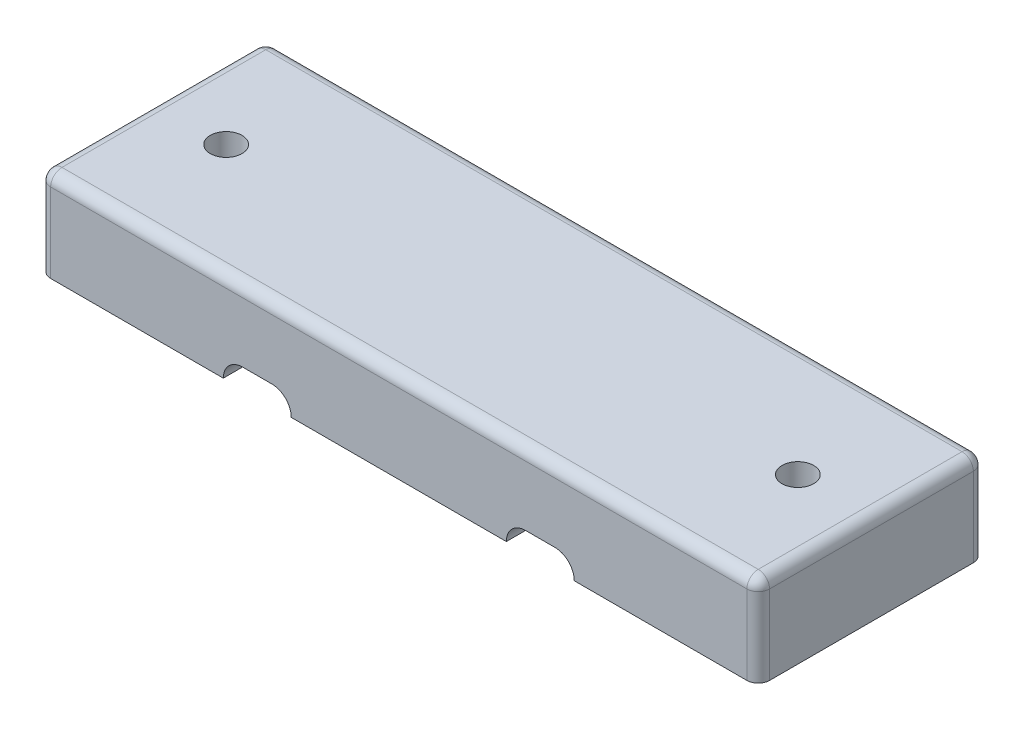
ISO-10303-21;
HEADER;
FILE_DESCRIPTION(('STEP AP214'),'2;1');
FILE_NAME('part.step','',(''),(''),'','','');
FILE_SCHEMA(('AUTOMOTIVE_DESIGN { 1 0 10303 214 1 1 1 1 }'));
ENDSEC;
DATA;
#1=APPLICATION_CONTEXT('core data for automotive mechanical design processes');
#2=APPLICATION_PROTOCOL_DEFINITION('international standard','automotive_design',2000,#1);
#3=PRODUCT_CONTEXT('',#1,'mechanical');
#4=PRODUCT('Part','Part','',(#3));
#5=PRODUCT_RELATED_PRODUCT_CATEGORY('part','',(#4));
#6=PRODUCT_DEFINITION_FORMATION('','',#4);
#7=PRODUCT_DEFINITION_CONTEXT('part definition',#1,'design');
#8=PRODUCT_DEFINITION('design','',#6,#7);
#9=PRODUCT_DEFINITION_SHAPE('','',#8);
#10=(LENGTH_UNIT() NAMED_UNIT(*) SI_UNIT(.MILLI.,.METRE.));
#11=(NAMED_UNIT(*) PLANE_ANGLE_UNIT() SI_UNIT($,.RADIAN.));
#12=(NAMED_UNIT(*) SI_UNIT($,.STERADIAN.) SOLID_ANGLE_UNIT());
#13=UNCERTAINTY_MEASURE_WITH_UNIT(LENGTH_MEASURE(1.E-05),#10,'distance_accuracy_value','');
#14=(GEOMETRIC_REPRESENTATION_CONTEXT(3) GLOBAL_UNCERTAINTY_ASSIGNED_CONTEXT((#13)) GLOBAL_UNIT_ASSIGNED_CONTEXT((#10,
#11,#12)) REPRESENTATION_CONTEXT('',''));
#15=CARTESIAN_POINT('',(0.,0.,0.));
#16=DIRECTION('',(0.,0.,1.));
#17=DIRECTION('',(1.,0.,0.));
#18=AXIS2_PLACEMENT_3D('',#15,#16,#17);
#19=CARTESIAN_POINT('',(0.,0.,0.));
#20=DIRECTION('',(0.,1.,0.));
#21=DIRECTION('',(0.,0.,1.));
#22=AXIS2_PLACEMENT_3D('',#19,#20,#21);
#23=PLANE('',#22);
#24=CARTESIAN_POINT('',(-25.25,0.,0.));
#25=DIRECTION('',(0.,1.,0.));
#26=DIRECTION('',(0.,0.,1.));
#27=AXIS2_PLACEMENT_3D('',#24,#25,#26);
#28=CIRCLE('',#27,1.4);
#29=CARTESIAN_POINT('',(-25.25,0.,1.4));
#30=VERTEX_POINT('',#29);
#31=EDGE_CURVE('E232',#30,#30,#28,.T.);
#32=ORIENTED_EDGE('',*,*,#31,.T.);
#33=EDGE_LOOP('',(#32));
#34=FACE_BOUND('',#33,.T.);
#35=DIRECTION('',(0.,0.,1.));
#36=VECTOR('',#35,1.);
#37=CARTESIAN_POINT('',(-31.75,0.,-10.));
#38=LINE('',#37,#36);
#39=CARTESIAN_POINT('',(-31.75,0.,-9.));
#40=VERTEX_POINT('',#39);
#41=CARTESIAN_POINT('',(-31.75,0.,9.));
#42=VERTEX_POINT('',#41);
#43=EDGE_CURVE('E238',#40,#42,#38,.T.);
#44=ORIENTED_EDGE('',*,*,#43,.F.);
#45=CARTESIAN_POINT('',(-30.75,0.,-9.));
#46=DIRECTION('',(0.,1.,0.));
#47=DIRECTION('',(0.,0.,1.));
#48=AXIS2_PLACEMENT_3D('',#45,#46,#47);
#49=CIRCLE('',#48,1.);
#50=CARTESIAN_POINT('',(-30.75,0.,-10.));
#51=VERTEX_POINT('',#50);
#52=EDGE_CURVE('E11',#40,#51,#49,.F.);
#53=ORIENTED_EDGE('',*,*,#52,.T.);
#54=DIRECTION('',(-1.,0.,0.));
#55=VECTOR('',#54,1.);
#56=CARTESIAN_POINT('',(-31.75,0.,-10.));
#57=LINE('',#56,#55);
#58=CARTESIAN_POINT('',(-15.5,0.,-10.));
#59=VERTEX_POINT('',#58);
#60=EDGE_CURVE('E249',#59,#51,#57,.T.);
#61=ORIENTED_EDGE('',*,*,#60,.F.);
#62=DIRECTION('',(0.,0.,-1.));
#63=VECTOR('',#62,1.);
#64=CARTESIAN_POINT('',(-15.5,0.,10.));
#65=LINE('',#64,#63);
#66=CARTESIAN_POINT('',(-15.5,0.,10.));
#67=VERTEX_POINT('',#66);
#68=EDGE_CURVE('E196',#67,#59,#65,.T.);
#69=ORIENTED_EDGE('',*,*,#68,.F.);
#70=DIRECTION('',(1.,0.,0.));
#71=VECTOR('',#70,1.);
#72=CARTESIAN_POINT('',(-31.75,0.,10.));
#73=LINE('',#72,#71);
#74=CARTESIAN_POINT('',(-30.75,0.,10.));
#75=VERTEX_POINT('',#74);
#76=EDGE_CURVE('E186',#75,#67,#73,.T.);
#77=ORIENTED_EDGE('',*,*,#76,.F.);
#78=CARTESIAN_POINT('',(-30.75,0.,9.));
#79=DIRECTION('',(0.,1.,0.));
#80=DIRECTION('',(0.,0.,1.));
#81=AXIS2_PLACEMENT_3D('',#78,#79,#80);
#82=CIRCLE('',#81,1.);
#83=EDGE_CURVE('E48',#75,#42,#82,.F.);
#84=ORIENTED_EDGE('',*,*,#83,.T.);
#85=EDGE_LOOP('',(#44,#53,#61,#69,#77,#84));
#86=FACE_BOUND('',#85,.T.);
#87=ADVANCED_FACE('F39',(#34,#86),#23,.F.);
#88=CARTESIAN_POINT('',(-9.5,0.,10.));
#89=VERTEX_POINT('',#88);
#90=CARTESIAN_POINT('',(9.5,0.,10.));
#91=VERTEX_POINT('',#90);
#92=EDGE_CURVE('E246',#89,#91,#73,.T.);
#93=ORIENTED_EDGE('',*,*,#92,.F.);
#94=DIRECTION('',(0.,0.,-1.));
#95=VECTOR('',#94,1.);
#96=CARTESIAN_POINT('',(-9.5,0.,10.));
#97=LINE('',#96,#95);
#98=CARTESIAN_POINT('',(-9.5,0.,-10.));
#99=VERTEX_POINT('',#98);
#100=EDGE_CURVE('E199',#89,#99,#97,.T.);
#101=ORIENTED_EDGE('',*,*,#100,.T.);
#102=CARTESIAN_POINT('',(9.5,0.,-10.));
#103=VERTEX_POINT('',#102);
#104=EDGE_CURVE('E253',#103,#99,#57,.T.);
#105=ORIENTED_EDGE('',*,*,#104,.F.);
#106=DIRECTION('',(0.,0.,-1.));
#107=VECTOR('',#106,1.);
#108=CARTESIAN_POINT('',(9.5,0.,10.));
#109=LINE('',#108,#107);
#110=EDGE_CURVE('E212',#91,#103,#109,.T.);
#111=ORIENTED_EDGE('',*,*,#110,.F.);
#112=EDGE_LOOP('',(#93,#101,#105,#111));
#113=FACE_BOUND('',#112,.T.);
#114=ADVANCED_FACE('F366',(#113),#23,.F.);
#115=CARTESIAN_POINT('',(0.,8.,0.));
#116=DIRECTION('',(0.,1.,0.));
#117=DIRECTION('',(0.,0.,1.));
#118=AXIS2_PLACEMENT_3D('',#115,#116,#117);
#119=PLANE('',#118);
#120=DIRECTION('',(1.,0.,0.));
#121=VECTOR('',#120,1.);
#122=CARTESIAN_POINT('',(31.75,8.,9.));
#123=LINE('',#122,#121);
#124=CARTESIAN_POINT('',(-30.75,8.,9.));
#125=VERTEX_POINT('',#124);
#126=CARTESIAN_POINT('',(30.75,8.,9.));
#127=VERTEX_POINT('',#126);
#128=EDGE_CURVE('E252',#125,#127,#123,.T.);
#129=ORIENTED_EDGE('',*,*,#128,.T.);
#130=DIRECTION('',(0.,0.,-1.));
#131=VECTOR('',#130,1.);
#132=CARTESIAN_POINT('',(30.75,8.,-10.));
#133=LINE('',#132,#131);
#134=CARTESIAN_POINT('',(30.75,8.,-9.));
#135=VERTEX_POINT('',#134);
#136=EDGE_CURVE('E259',#127,#135,#133,.T.);
#137=ORIENTED_EDGE('',*,*,#136,.T.);
#138=DIRECTION('',(-1.,0.,0.));
#139=VECTOR('',#138,1.);
#140=CARTESIAN_POINT('',(-31.75,8.,-9.));
#141=LINE('',#140,#139);
#142=CARTESIAN_POINT('',(-30.75,8.,-9.));
#143=VERTEX_POINT('',#142);
#144=EDGE_CURVE('E257',#135,#143,#141,.T.);
#145=ORIENTED_EDGE('',*,*,#144,.T.);
#146=DIRECTION('',(0.,0.,1.));
#147=VECTOR('',#146,1.);
#148=CARTESIAN_POINT('',(-30.75,8.,10.));
#149=LINE('',#148,#147);
#150=EDGE_CURVE('E255',#143,#125,#149,.T.);
#151=ORIENTED_EDGE('',*,*,#150,.T.);
#152=EDGE_LOOP('',(#129,#137,#145,#151));
#153=FACE_BOUND('',#152,.T.);
#154=CARTESIAN_POINT('',(-25.25,8.,0.));
#155=DIRECTION('',(0.,1.,0.));
#156=DIRECTION('',(0.,0.,1.));
#157=AXIS2_PLACEMENT_3D('',#154,#155,#156);
#158=CIRCLE('',#157,1.4);
#159=CARTESIAN_POINT('',(-25.25,8.,1.4));
#160=VERTEX_POINT('',#159);
#161=EDGE_CURVE('E235',#160,#160,#158,.T.);
#162=ORIENTED_EDGE('',*,*,#161,.F.);
#163=EDGE_LOOP('',(#162));
#164=FACE_BOUND('',#163,.T.);
#165=CARTESIAN_POINT('',(25.25,8.,0.));
#166=DIRECTION('',(0.,1.,0.));
#167=DIRECTION('',(0.,0.,-1.));
#168=AXIS2_PLACEMENT_3D('',#165,#166,#167);
#169=CIRCLE('',#168,1.4);
#170=CARTESIAN_POINT('',(25.25,8.,-1.4));
#171=VERTEX_POINT('',#170);
#172=EDGE_CURVE('E229',#171,#171,#169,.T.);
#173=ORIENTED_EDGE('',*,*,#172,.F.);
#174=EDGE_LOOP('',(#173));
#175=FACE_BOUND('',#174,.T.);
#176=ADVANCED_FACE('F334',(#153,#164,#175),#119,.T.);
#177=CARTESIAN_POINT('',(30.75,0.,-10.));
#178=VERTEX_POINT('',#177);
#179=CARTESIAN_POINT('',(15.5,0.,-10.));
#180=VERTEX_POINT('',#179);
#181=EDGE_CURVE('E250',#178,#180,#57,.T.);
#182=ORIENTED_EDGE('',*,*,#181,.F.);
#183=CARTESIAN_POINT('',(30.75,0.,-9.));
#184=DIRECTION('',(0.,1.,0.));
#185=DIRECTION('',(0.,0.,1.));
#186=AXIS2_PLACEMENT_3D('',#183,#184,#185);
#187=CIRCLE('',#186,1.);
#188=CARTESIAN_POINT('',(31.75,0.,-9.));
#189=VERTEX_POINT('',#188);
#190=EDGE_CURVE('E287',#178,#189,#187,.F.);
#191=ORIENTED_EDGE('',*,*,#190,.T.);
#192=DIRECTION('',(0.,0.,-1.));
#193=VECTOR('',#192,1.);
#194=CARTESIAN_POINT('',(31.75,0.,-10.));
#195=LINE('',#194,#193);
#196=CARTESIAN_POINT('',(31.75,0.,9.));
#197=VERTEX_POINT('',#196);
#198=EDGE_CURVE('E245',#197,#189,#195,.T.);
#199=ORIENTED_EDGE('',*,*,#198,.F.);
#200=CARTESIAN_POINT('',(30.75,0.,9.));
#201=DIRECTION('',(0.,1.,0.));
#202=DIRECTION('',(0.,0.,1.));
#203=AXIS2_PLACEMENT_3D('',#200,#201,#202);
#204=CIRCLE('',#203,1.);
#205=CARTESIAN_POINT('',(30.75,0.,10.));
#206=VERTEX_POINT('',#205);
#207=EDGE_CURVE('E285',#197,#206,#204,.F.);
#208=ORIENTED_EDGE('',*,*,#207,.T.);
#209=CARTESIAN_POINT('',(15.5,0.,10.));
#210=VERTEX_POINT('',#209);
#211=EDGE_CURVE('E243',#210,#206,#73,.T.);
#212=ORIENTED_EDGE('',*,*,#211,.F.);
#213=DIRECTION('',(0.,0.,-1.));
#214=VECTOR('',#213,1.);
#215=CARTESIAN_POINT('',(15.5,0.,10.));
#216=LINE('',#215,#214);
#217=EDGE_CURVE('E209',#210,#180,#216,.T.);
#218=ORIENTED_EDGE('',*,*,#217,.T.);
#219=EDGE_LOOP('',(#182,#191,#199,#208,#212,#218));
#220=FACE_BOUND('',#219,.T.);
#221=CARTESIAN_POINT('',(25.25,0.,0.));
#222=DIRECTION('',(0.,1.,0.));
#223=DIRECTION('',(0.,0.,-1.));
#224=AXIS2_PLACEMENT_3D('',#221,#222,#223);
#225=CIRCLE('',#224,1.4);
#226=CARTESIAN_POINT('',(25.25,0.,-1.4));
#227=VERTEX_POINT('',#226);
#228=EDGE_CURVE('E198',#227,#227,#225,.T.);
#229=ORIENTED_EDGE('',*,*,#228,.T.);
#230=EDGE_LOOP('',(#229));
#231=FACE_BOUND('',#230,.T.);
#232=ADVANCED_FACE('F403',(#220,#231),#23,.F.);
#233=CARTESIAN_POINT('',(-31.75,8.,-10.));
#234=DIRECTION('',(1.,0.,0.));
#235=DIRECTION('',(0.,0.,-1.));
#236=AXIS2_PLACEMENT_3D('',#233,#234,#235);
#237=PLANE('',#236);
#238=DIRECTION('',(0.,0.,1.));
#239=VECTOR('',#238,1.);
#240=CARTESIAN_POINT('',(-31.75,7.,-10.));
#241=LINE('',#240,#239);
#242=CARTESIAN_POINT('',(-31.75,7.,9.));
#243=VERTEX_POINT('',#242);
#244=CARTESIAN_POINT('',(-31.75,7.,-9.));
#245=VERTEX_POINT('',#244);
#246=EDGE_CURVE('E277',#243,#245,#241,.F.);
#247=ORIENTED_EDGE('',*,*,#246,.T.);
#248=DIRECTION('',(0.,-1.,0.));
#249=VECTOR('',#248,1.);
#250=CARTESIAN_POINT('',(-31.75,8.,-9.));
#251=LINE('',#250,#249);
#252=EDGE_CURVE('E279',#245,#40,#251,.T.);
#253=ORIENTED_EDGE('',*,*,#252,.T.);
#254=ORIENTED_EDGE('',*,*,#43,.T.);
#255=DIRECTION('',(0.,-1.,0.));
#256=VECTOR('',#255,1.);
#257=CARTESIAN_POINT('',(-31.75,8.,9.));
#258=LINE('',#257,#256);
#259=EDGE_CURVE('E275',#42,#243,#258,.F.);
#260=ORIENTED_EDGE('',*,*,#259,.T.);
#261=EDGE_LOOP('',(#247,#253,#254,#260));
#262=FACE_BOUND('',#261,.T.);
#263=ADVANCED_FACE('F345',(#262),#237,.F.);
#264=CARTESIAN_POINT('',(-31.75,8.,10.));
#265=DIRECTION('',(0.,0.,-1.));
#266=DIRECTION('',(-1.,0.,0.));
#267=AXIS2_PLACEMENT_3D('',#264,#265,#266);
#268=PLANE('',#267);
#269=ORIENTED_EDGE('',*,*,#211,.T.);
#270=DIRECTION('',(0.,-1.,0.));
#271=VECTOR('',#270,1.);
#272=CARTESIAN_POINT('',(30.75,8.,10.));
#273=LINE('',#272,#271);
#274=CARTESIAN_POINT('',(30.75,7.,10.));
#275=VERTEX_POINT('',#274);
#276=EDGE_CURVE('E56',#206,#275,#273,.F.);
#277=ORIENTED_EDGE('',*,*,#276,.T.);
#278=DIRECTION('',(1.,0.,0.));
#279=VECTOR('',#278,1.);
#280=CARTESIAN_POINT('',(-31.75,7.,10.));
#281=LINE('',#280,#279);
#282=CARTESIAN_POINT('',(-30.75,7.,10.));
#283=VERTEX_POINT('',#282);
#284=EDGE_CURVE('E60',#275,#283,#281,.F.);
#285=ORIENTED_EDGE('',*,*,#284,.T.);
#286=DIRECTION('',(0.,-1.,0.));
#287=VECTOR('',#286,1.);
#288=CARTESIAN_POINT('',(-30.75,8.,10.));
#289=LINE('',#288,#287);
#290=EDGE_CURVE('E281',#283,#75,#289,.T.);
#291=ORIENTED_EDGE('',*,*,#290,.T.);
#292=ORIENTED_EDGE('',*,*,#76,.T.);
#293=CARTESIAN_POINT('',(-13.8,0.,10.));
#294=DIRECTION('',(0.,0.,-1.));
#295=DIRECTION('',(1.,0.,0.));
#296=AXIS2_PLACEMENT_3D('',#293,#294,#295);
#297=CIRCLE('',#296,1.7);
#298=CARTESIAN_POINT('',(-13.8,1.7,10.));
#299=VERTEX_POINT('',#298);
#300=EDGE_CURVE('E168',#67,#299,#297,.T.);
#301=ORIENTED_EDGE('',*,*,#300,.T.);
#302=DIRECTION('',(1.,0.,0.));
#303=VECTOR('',#302,1.);
#304=CARTESIAN_POINT('',(-13.8,1.7,10.));
#305=LINE('',#304,#303);
#306=CARTESIAN_POINT('',(-11.2,1.7,10.));
#307=VERTEX_POINT('',#306);
#308=EDGE_CURVE('E179',#299,#307,#305,.T.);
#309=ORIENTED_EDGE('',*,*,#308,.T.);
#310=CARTESIAN_POINT('',(-11.2,0.,10.));
#311=DIRECTION('',(0.,0.,-1.));
#312=DIRECTION('',(-1.,0.,0.));
#313=AXIS2_PLACEMENT_3D('',#310,#311,#312);
#314=CIRCLE('',#313,1.7);
#315=EDGE_CURVE('E176',#307,#89,#314,.T.);
#316=ORIENTED_EDGE('',*,*,#315,.T.);
#317=ORIENTED_EDGE('',*,*,#92,.T.);
#318=CARTESIAN_POINT('',(11.2,0.,10.));
#319=DIRECTION('',(0.,0.,-1.));
#320=DIRECTION('',(1.,0.,0.));
#321=AXIS2_PLACEMENT_3D('',#318,#319,#320);
#322=CIRCLE('',#321,1.7);
#323=CARTESIAN_POINT('',(11.2,1.7,10.));
#324=VERTEX_POINT('',#323);
#325=EDGE_CURVE('E218',#91,#324,#322,.T.);
#326=ORIENTED_EDGE('',*,*,#325,.T.);
#327=DIRECTION('',(1.,0.,0.));
#328=VECTOR('',#327,1.);
#329=CARTESIAN_POINT('',(11.2,1.7,10.));
#330=LINE('',#329,#328);
#331=CARTESIAN_POINT('',(13.8,1.7,10.));
#332=VERTEX_POINT('',#331);
#333=EDGE_CURVE('E224',#324,#332,#330,.T.);
#334=ORIENTED_EDGE('',*,*,#333,.T.);
#335=CARTESIAN_POINT('',(13.8,0.,10.));
#336=DIRECTION('',(0.,0.,-1.));
#337=DIRECTION('',(-1.,0.,0.));
#338=AXIS2_PLACEMENT_3D('',#335,#336,#337);
#339=CIRCLE('',#338,1.7);
#340=EDGE_CURVE('E206',#332,#210,#339,.T.);
#341=ORIENTED_EDGE('',*,*,#340,.T.);
#342=EDGE_LOOP('',(#269,#277,#285,#291,#292,#301,#309,#316,#317,#326,#334,#341));
#343=FACE_BOUND('',#342,.T.);
#344=ADVANCED_FACE('F184',(#343),#268,.F.);
#345=CARTESIAN_POINT('',(31.75,8.,-10.));
#346=DIRECTION('',(-1.,0.,0.));
#347=DIRECTION('',(0.,0.,1.));
#348=AXIS2_PLACEMENT_3D('',#345,#346,#347);
#349=PLANE('',#348);
#350=ORIENTED_EDGE('',*,*,#198,.T.);
#351=DIRECTION('',(0.,-1.,0.));
#352=VECTOR('',#351,1.);
#353=CARTESIAN_POINT('',(31.75,8.,-9.));
#354=LINE('',#353,#352);
#355=CARTESIAN_POINT('',(31.75,7.,-9.));
#356=VERTEX_POINT('',#355);
#357=EDGE_CURVE('E267',#189,#356,#354,.F.);
#358=ORIENTED_EDGE('',*,*,#357,.T.);
#359=DIRECTION('',(0.,0.,-1.));
#360=VECTOR('',#359,1.);
#361=CARTESIAN_POINT('',(31.75,7.,10.));
#362=LINE('',#361,#360);
#363=CARTESIAN_POINT('',(31.75,7.,9.));
#364=VERTEX_POINT('',#363);
#365=EDGE_CURVE('E264',#356,#364,#362,.F.);
#366=ORIENTED_EDGE('',*,*,#365,.T.);
#367=DIRECTION('',(0.,-1.,0.));
#368=VECTOR('',#367,1.);
#369=CARTESIAN_POINT('',(31.75,8.,9.));
#370=LINE('',#369,#368);
#371=EDGE_CURVE('E262',#364,#197,#370,.T.);
#372=ORIENTED_EDGE('',*,*,#371,.T.);
#373=EDGE_LOOP('',(#350,#358,#366,#372));
#374=FACE_BOUND('',#373,.T.);
#375=ADVANCED_FACE('F630',(#374),#349,.F.);
#376=CARTESIAN_POINT('',(-31.75,8.,-10.));
#377=DIRECTION('',(0.,0.,1.));
#378=DIRECTION('',(1.,0.,0.));
#379=AXIS2_PLACEMENT_3D('',#376,#377,#378);
#380=PLANE('',#379);
#381=DIRECTION('',(-1.,0.,0.));
#382=VECTOR('',#381,1.);
#383=CARTESIAN_POINT('',(31.75,7.,-10.));
#384=LINE('',#383,#382);
#385=CARTESIAN_POINT('',(-30.75,7.,-10.));
#386=VERTEX_POINT('',#385);
#387=CARTESIAN_POINT('',(30.75,7.,-10.));
#388=VERTEX_POINT('',#387);
#389=EDGE_CURVE('E271',#386,#388,#384,.F.);
#390=ORIENTED_EDGE('',*,*,#389,.T.);
#391=DIRECTION('',(0.,-1.,0.));
#392=VECTOR('',#391,1.);
#393=CARTESIAN_POINT('',(30.75,8.,-10.));
#394=LINE('',#393,#392);
#395=EDGE_CURVE('E273',#388,#178,#394,.T.);
#396=ORIENTED_EDGE('',*,*,#395,.T.);
#397=ORIENTED_EDGE('',*,*,#181,.T.);
#398=CARTESIAN_POINT('',(13.8,0.,-10.));
#399=DIRECTION('',(0.,0.,-1.));
#400=DIRECTION('',(-1.,0.,0.));
#401=AXIS2_PLACEMENT_3D('',#398,#399,#400);
#402=CIRCLE('',#401,1.7);
#403=CARTESIAN_POINT('',(13.8,1.7,-10.));
#404=VERTEX_POINT('',#403);
#405=EDGE_CURVE('E214',#404,#180,#402,.T.);
#406=ORIENTED_EDGE('',*,*,#405,.F.);
#407=DIRECTION('',(1.,0.,0.));
#408=VECTOR('',#407,1.);
#409=CARTESIAN_POINT('',(11.2,1.7,-10.));
#410=LINE('',#409,#408);
#411=CARTESIAN_POINT('',(11.2,1.7,-10.));
#412=VERTEX_POINT('',#411);
#413=EDGE_CURVE('E217',#412,#404,#410,.T.);
#414=ORIENTED_EDGE('',*,*,#413,.F.);
#415=CARTESIAN_POINT('',(11.2,0.,-10.));
#416=DIRECTION('',(0.,0.,-1.));
#417=DIRECTION('',(1.,0.,0.));
#418=AXIS2_PLACEMENT_3D('',#415,#416,#417);
#419=CIRCLE('',#418,1.7);
#420=EDGE_CURVE('E194',#103,#412,#419,.T.);
#421=ORIENTED_EDGE('',*,*,#420,.F.);
#422=ORIENTED_EDGE('',*,*,#104,.T.);
#423=CARTESIAN_POINT('',(-11.2,0.,-10.));
#424=DIRECTION('',(0.,0.,-1.));
#425=DIRECTION('',(-1.,0.,0.));
#426=AXIS2_PLACEMENT_3D('',#423,#424,#425);
#427=CIRCLE('',#426,1.7);
#428=CARTESIAN_POINT('',(-11.2,1.7,-10.));
#429=VERTEX_POINT('',#428);
#430=EDGE_CURVE('E187',#429,#99,#427,.T.);
#431=ORIENTED_EDGE('',*,*,#430,.F.);
#432=DIRECTION('',(1.,0.,0.));
#433=VECTOR('',#432,1.);
#434=CARTESIAN_POINT('',(-13.8,1.7,-10.));
#435=LINE('',#434,#433);
#436=CARTESIAN_POINT('',(-13.8,1.7,-10.));
#437=VERTEX_POINT('',#436);
#438=EDGE_CURVE('E189',#437,#429,#435,.T.);
#439=ORIENTED_EDGE('',*,*,#438,.F.);
#440=CARTESIAN_POINT('',(-13.8,0.,-10.));
#441=DIRECTION('',(0.,0.,-1.));
#442=DIRECTION('',(1.,0.,0.));
#443=AXIS2_PLACEMENT_3D('',#440,#441,#442);
#444=CIRCLE('',#443,1.7);
#445=EDGE_CURVE('E171',#59,#437,#444,.T.);
#446=ORIENTED_EDGE('',*,*,#445,.F.);
#447=ORIENTED_EDGE('',*,*,#60,.T.);
#448=DIRECTION('',(0.,-1.,0.));
#449=VECTOR('',#448,1.);
#450=CARTESIAN_POINT('',(-30.75,8.,-10.));
#451=LINE('',#450,#449);
#452=EDGE_CURVE('E269',#51,#386,#451,.F.);
#453=ORIENTED_EDGE('',*,*,#452,.T.);
#454=EDGE_LOOP('',(#390,#396,#397,#406,#414,#421,#422,#431,#439,#446,#447,#453));
#455=FACE_BOUND('',#454,.T.);
#456=ADVANCED_FACE('F357',(#455),#380,.F.);
#457=CARTESIAN_POINT('',(-25.25,8.,0.));
#458=DIRECTION('',(0.,-1.,0.));
#459=DIRECTION('',(0.,0.,-1.));
#460=AXIS2_PLACEMENT_3D('',#457,#458,#459);
#461=CYLINDRICAL_SURFACE('',#460,1.4);
#462=ORIENTED_EDGE('',*,*,#161,.T.);
#463=EDGE_LOOP('',(#462));
#464=FACE_BOUND('',#463,.T.);
#465=ORIENTED_EDGE('',*,*,#31,.F.);
#466=EDGE_LOOP('',(#465));
#467=FACE_BOUND('',#466,.T.);
#468=ADVANCED_FACE('F423',(#464,#467),#461,.F.);
#469=CARTESIAN_POINT('',(25.25,8.,0.));
#470=DIRECTION('',(0.,-1.,0.));
#471=DIRECTION('',(0.,0.,-1.));
#472=AXIS2_PLACEMENT_3D('',#469,#470,#471);
#473=CYLINDRICAL_SURFACE('',#472,1.4);
#474=ORIENTED_EDGE('',*,*,#172,.T.);
#475=EDGE_LOOP('',(#474));
#476=FACE_BOUND('',#475,.T.);
#477=ORIENTED_EDGE('',*,*,#228,.F.);
#478=EDGE_LOOP('',(#477));
#479=FACE_BOUND('',#478,.T.);
#480=ADVANCED_FACE('F420',(#476,#479),#473,.F.);
#481=CARTESIAN_POINT('',(11.2,0.,10.));
#482=DIRECTION('',(0.,0.,-1.));
#483=DIRECTION('',(-1.,0.,0.));
#484=AXIS2_PLACEMENT_3D('',#481,#482,#483);
#485=CYLINDRICAL_SURFACE('',#484,1.7);
#486=ORIENTED_EDGE('',*,*,#420,.T.);
#487=DIRECTION('',(0.,0.,-1.));
#488=VECTOR('',#487,1.);
#489=CARTESIAN_POINT('',(11.2,1.7,10.));
#490=LINE('',#489,#488);
#491=EDGE_CURVE('E203',#324,#412,#490,.T.);
#492=ORIENTED_EDGE('',*,*,#491,.F.);
#493=ORIENTED_EDGE('',*,*,#325,.F.);
#494=ORIENTED_EDGE('',*,*,#110,.T.);
#495=EDGE_LOOP('',(#486,#492,#493,#494));
#496=FACE_BOUND('',#495,.T.);
#497=ADVANCED_FACE('F422',(#496),#485,.F.);
#498=CARTESIAN_POINT('',(13.8,0.,10.));
#499=DIRECTION('',(0.,0.,-1.));
#500=DIRECTION('',(-1.,0.,0.));
#501=AXIS2_PLACEMENT_3D('',#498,#499,#500);
#502=CYLINDRICAL_SURFACE('',#501,1.7);
#503=ORIENTED_EDGE('',*,*,#405,.T.);
#504=ORIENTED_EDGE('',*,*,#217,.F.);
#505=ORIENTED_EDGE('',*,*,#340,.F.);
#506=DIRECTION('',(0.,0.,-1.));
#507=VECTOR('',#506,1.);
#508=CARTESIAN_POINT('',(13.8,1.7,10.));
#509=LINE('',#508,#507);
#510=EDGE_CURVE('E207',#332,#404,#509,.T.);
#511=ORIENTED_EDGE('',*,*,#510,.T.);
#512=EDGE_LOOP('',(#503,#504,#505,#511));
#513=FACE_BOUND('',#512,.T.);
#514=ADVANCED_FACE('F430',(#513),#502,.F.);
#515=CARTESIAN_POINT('',(11.2,1.7,10.));
#516=DIRECTION('',(0.,1.,0.));
#517=DIRECTION('',(0.,0.,1.));
#518=AXIS2_PLACEMENT_3D('',#515,#516,#517);
#519=PLANE('',#518);
#520=ORIENTED_EDGE('',*,*,#413,.T.);
#521=ORIENTED_EDGE('',*,*,#510,.F.);
#522=ORIENTED_EDGE('',*,*,#333,.F.);
#523=ORIENTED_EDGE('',*,*,#491,.T.);
#524=EDGE_LOOP('',(#520,#521,#522,#523));
#525=FACE_BOUND('',#524,.T.);
#526=ADVANCED_FACE('F438',(#525),#519,.F.);
#527=CARTESIAN_POINT('',(-13.8,0.,10.));
#528=DIRECTION('',(0.,0.,-1.));
#529=DIRECTION('',(-1.,0.,0.));
#530=AXIS2_PLACEMENT_3D('',#527,#528,#529);
#531=CYLINDRICAL_SURFACE('',#530,1.7);
#532=ORIENTED_EDGE('',*,*,#445,.T.);
#533=DIRECTION('',(0.,0.,-1.));
#534=VECTOR('',#533,1.);
#535=CARTESIAN_POINT('',(-13.8,1.7,10.));
#536=LINE('',#535,#534);
#537=EDGE_CURVE('E164',#299,#437,#536,.T.);
#538=ORIENTED_EDGE('',*,*,#537,.F.);
#539=ORIENTED_EDGE('',*,*,#300,.F.);
#540=ORIENTED_EDGE('',*,*,#68,.T.);
#541=EDGE_LOOP('',(#532,#538,#539,#540));
#542=FACE_BOUND('',#541,.T.);
#543=ADVANCED_FACE('F166',(#542),#531,.F.);
#544=CARTESIAN_POINT('',(-11.2,0.,10.));
#545=DIRECTION('',(0.,0.,-1.));
#546=DIRECTION('',(-1.,0.,0.));
#547=AXIS2_PLACEMENT_3D('',#544,#545,#546);
#548=CYLINDRICAL_SURFACE('',#547,1.7);
#549=ORIENTED_EDGE('',*,*,#430,.T.);
#550=ORIENTED_EDGE('',*,*,#100,.F.);
#551=ORIENTED_EDGE('',*,*,#315,.F.);
#552=DIRECTION('',(0.,0.,-1.));
#553=VECTOR('',#552,1.);
#554=CARTESIAN_POINT('',(-11.2,1.7,10.));
#555=LINE('',#554,#553);
#556=EDGE_CURVE('E175',#307,#429,#555,.T.);
#557=ORIENTED_EDGE('',*,*,#556,.T.);
#558=EDGE_LOOP('',(#549,#550,#551,#557));
#559=FACE_BOUND('',#558,.T.);
#560=ADVANCED_FACE('F369',(#559),#548,.F.);
#561=CARTESIAN_POINT('',(-13.8,1.7,10.));
#562=DIRECTION('',(0.,1.,0.));
#563=DIRECTION('',(0.,0.,1.));
#564=AXIS2_PLACEMENT_3D('',#561,#562,#563);
#565=PLANE('',#564);
#566=ORIENTED_EDGE('',*,*,#438,.T.);
#567=ORIENTED_EDGE('',*,*,#556,.F.);
#568=ORIENTED_EDGE('',*,*,#308,.F.);
#569=ORIENTED_EDGE('',*,*,#537,.T.);
#570=EDGE_LOOP('',(#566,#567,#568,#569));
#571=FACE_BOUND('',#570,.T.);
#572=ADVANCED_FACE('F180',(#571),#565,.F.);
#573=CARTESIAN_POINT('',(-30.75,8.,9.));
#574=DIRECTION('',(0.,-1.,0.));
#575=DIRECTION('',(0.,0.,-1.));
#576=AXIS2_PLACEMENT_3D('',#573,#574,#575);
#577=CYLINDRICAL_SURFACE('',#576,1.);
#578=ORIENTED_EDGE('',*,*,#83,.F.);
#579=ORIENTED_EDGE('',*,*,#290,.F.);
#580=CARTESIAN_POINT('',(-30.75,7.,9.));
#581=DIRECTION('',(0.,1.,0.));
#582=DIRECTION('',(0.,0.,1.));
#583=AXIS2_PLACEMENT_3D('',#580,#581,#582);
#584=CIRCLE('',#583,1.);
#585=EDGE_CURVE('E43',#243,#283,#584,.T.);
#586=ORIENTED_EDGE('',*,*,#585,.F.);
#587=ORIENTED_EDGE('',*,*,#259,.F.);
#588=EDGE_LOOP('',(#578,#579,#586,#587));
#589=FACE_BOUND('',#588,.T.);
#590=ADVANCED_FACE('F41',(#589),#577,.T.);
#591=CARTESIAN_POINT('',(-30.75,7.,0.));
#592=DIRECTION('',(0.,0.,-1.));
#593=DIRECTION('',(-1.,0.,0.));
#594=AXIS2_PLACEMENT_3D('',#591,#592,#593);
#595=CYLINDRICAL_SURFACE('',#594,1.);
#596=CARTESIAN_POINT('',(-30.75,7.,-9.));
#597=DIRECTION('',(0.,0.,-1.));
#598=DIRECTION('',(-1.,0.,0.));
#599=AXIS2_PLACEMENT_3D('',#596,#597,#598);
#600=CIRCLE('',#599,1.);
#601=EDGE_CURVE('E315',#245,#143,#600,.T.);
#602=ORIENTED_EDGE('',*,*,#601,.F.);
#603=ORIENTED_EDGE('',*,*,#246,.F.);
#604=CARTESIAN_POINT('',(-30.75,7.,9.));
#605=DIRECTION('',(0.,0.,1.));
#606=DIRECTION('',(1.,0.,0.));
#607=AXIS2_PLACEMENT_3D('',#604,#605,#606);
#608=CIRCLE('',#607,1.);
#609=EDGE_CURVE('E317',#125,#243,#608,.T.);
#610=ORIENTED_EDGE('',*,*,#609,.F.);
#611=ORIENTED_EDGE('',*,*,#150,.F.);
#612=EDGE_LOOP('',(#602,#603,#610,#611));
#613=FACE_BOUND('',#612,.T.);
#614=ADVANCED_FACE('F342',(#613),#595,.T.);
#615=CARTESIAN_POINT('',(-30.75,8.,-9.));
#616=DIRECTION('',(0.,-1.,0.));
#617=DIRECTION('',(0.,0.,-1.));
#618=AXIS2_PLACEMENT_3D('',#615,#616,#617);
#619=CYLINDRICAL_SURFACE('',#618,1.);
#620=ORIENTED_EDGE('',*,*,#52,.F.);
#621=ORIENTED_EDGE('',*,*,#252,.F.);
#622=CARTESIAN_POINT('',(-30.75,7.,-9.));
#623=DIRECTION('',(0.,1.,0.));
#624=DIRECTION('',(0.,0.,1.));
#625=AXIS2_PLACEMENT_3D('',#622,#623,#624);
#626=CIRCLE('',#625,1.);
#627=EDGE_CURVE('E312',#386,#245,#626,.T.);
#628=ORIENTED_EDGE('',*,*,#627,.F.);
#629=ORIENTED_EDGE('',*,*,#452,.F.);
#630=EDGE_LOOP('',(#620,#621,#628,#629));
#631=FACE_BOUND('',#630,.T.);
#632=ADVANCED_FACE('F350',(#631),#619,.T.);
#633=CARTESIAN_POINT('',(-30.75,7.,9.));
#634=DIRECTION('',(-1.,0.,0.));
#635=DIRECTION('',(0.,0.,1.));
#636=AXIS2_PLACEMENT_3D('',#633,#634,#635);
#637=SPHERICAL_SURFACE('',#636,1.);
#638=ORIENTED_EDGE('',*,*,#609,.T.);
#639=ORIENTED_EDGE('',*,*,#585,.T.);
#640=CARTESIAN_POINT('',(-30.75,7.,9.));
#641=DIRECTION('',(-1.,0.,0.));
#642=DIRECTION('',(0.,0.,1.));
#643=AXIS2_PLACEMENT_3D('',#640,#641,#642);
#644=CIRCLE('',#643,1.);
#645=EDGE_CURVE('E309',#125,#283,#644,.F.);
#646=ORIENTED_EDGE('',*,*,#645,.F.);
#647=EDGE_LOOP('',(#638,#639,#646));
#648=FACE_BOUND('',#647,.T.);
#649=ADVANCED_FACE('F324',(#648),#637,.T.);
#650=CARTESIAN_POINT('',(-30.75,7.,-9.));
#651=DIRECTION('',(-1.,0.,0.));
#652=DIRECTION('',(0.,0.,1.));
#653=AXIS2_PLACEMENT_3D('',#650,#651,#652);
#654=SPHERICAL_SURFACE('',#653,1.);
#655=ORIENTED_EDGE('',*,*,#627,.T.);
#656=ORIENTED_EDGE('',*,*,#601,.T.);
#657=CARTESIAN_POINT('',(-30.75,7.,-9.));
#658=DIRECTION('',(-1.,0.,0.));
#659=DIRECTION('',(0.,0.,1.));
#660=AXIS2_PLACEMENT_3D('',#657,#658,#659);
#661=CIRCLE('',#660,1.);
#662=EDGE_CURVE('E306',#386,#143,#661,.F.);
#663=ORIENTED_EDGE('',*,*,#662,.F.);
#664=EDGE_LOOP('',(#655,#656,#663));
#665=FACE_BOUND('',#664,.T.);
#666=ADVANCED_FACE('F391',(#665),#654,.T.);
#667=CARTESIAN_POINT('',(30.75,8.,9.));
#668=DIRECTION('',(0.,-1.,0.));
#669=DIRECTION('',(0.,0.,-1.));
#670=AXIS2_PLACEMENT_3D('',#667,#668,#669);
#671=CYLINDRICAL_SURFACE('',#670,1.);
#672=ORIENTED_EDGE('',*,*,#207,.F.);
#673=ORIENTED_EDGE('',*,*,#371,.F.);
#674=CARTESIAN_POINT('',(30.75,7.,9.));
#675=DIRECTION('',(0.,1.,0.));
#676=DIRECTION('',(0.,0.,1.));
#677=AXIS2_PLACEMENT_3D('',#674,#675,#676);
#678=CIRCLE('',#677,1.);
#679=EDGE_CURVE('E303',#275,#364,#678,.T.);
#680=ORIENTED_EDGE('',*,*,#679,.F.);
#681=ORIENTED_EDGE('',*,*,#276,.F.);
#682=EDGE_LOOP('',(#672,#673,#680,#681));
#683=FACE_BOUND('',#682,.T.);
#684=ADVANCED_FACE('F375',(#683),#671,.T.);
#685=CARTESIAN_POINT('',(0.,7.,9.));
#686=DIRECTION('',(-1.,0.,0.));
#687=DIRECTION('',(0.,0.,1.));
#688=AXIS2_PLACEMENT_3D('',#685,#686,#687);
#689=CYLINDRICAL_SURFACE('',#688,1.);
#690=ORIENTED_EDGE('',*,*,#645,.T.);
#691=ORIENTED_EDGE('',*,*,#284,.F.);
#692=CARTESIAN_POINT('',(30.75,7.,9.));
#693=DIRECTION('',(1.,0.,0.));
#694=DIRECTION('',(0.,0.,-1.));
#695=AXIS2_PLACEMENT_3D('',#692,#693,#694);
#696=CIRCLE('',#695,1.);
#697=EDGE_CURVE('E300',#127,#275,#696,.T.);
#698=ORIENTED_EDGE('',*,*,#697,.F.);
#699=ORIENTED_EDGE('',*,*,#128,.F.);
#700=EDGE_LOOP('',(#690,#691,#698,#699));
#701=FACE_BOUND('',#700,.T.);
#702=ADVANCED_FACE('F329',(#701),#689,.T.);
#703=CARTESIAN_POINT('',(0.,7.,-9.));
#704=DIRECTION('',(1.,0.,0.));
#705=DIRECTION('',(0.,0.,-1.));
#706=AXIS2_PLACEMENT_3D('',#703,#704,#705);
#707=CYLINDRICAL_SURFACE('',#706,1.);
#708=ORIENTED_EDGE('',*,*,#662,.T.);
#709=ORIENTED_EDGE('',*,*,#144,.F.);
#710=CARTESIAN_POINT('',(30.75,7.,-9.));
#711=DIRECTION('',(1.,0.,0.));
#712=DIRECTION('',(0.,0.,-1.));
#713=AXIS2_PLACEMENT_3D('',#710,#711,#712);
#714=CIRCLE('',#713,1.);
#715=EDGE_CURVE('E297',#388,#135,#714,.T.);
#716=ORIENTED_EDGE('',*,*,#715,.F.);
#717=ORIENTED_EDGE('',*,*,#389,.F.);
#718=EDGE_LOOP('',(#708,#709,#716,#717));
#719=FACE_BOUND('',#718,.T.);
#720=ADVANCED_FACE('F389',(#719),#707,.T.);
#721=CARTESIAN_POINT('',(30.75,8.,-9.));
#722=DIRECTION('',(0.,-1.,0.));
#723=DIRECTION('',(0.,0.,-1.));
#724=AXIS2_PLACEMENT_3D('',#721,#722,#723);
#725=CYLINDRICAL_SURFACE('',#724,1.);
#726=ORIENTED_EDGE('',*,*,#190,.F.);
#727=ORIENTED_EDGE('',*,*,#395,.F.);
#728=CARTESIAN_POINT('',(30.75,7.,-9.));
#729=DIRECTION('',(0.,1.,0.));
#730=DIRECTION('',(0.,0.,1.));
#731=AXIS2_PLACEMENT_3D('',#728,#729,#730);
#732=CIRCLE('',#731,1.);
#733=EDGE_CURVE('E294',#356,#388,#732,.T.);
#734=ORIENTED_EDGE('',*,*,#733,.F.);
#735=ORIENTED_EDGE('',*,*,#357,.F.);
#736=EDGE_LOOP('',(#726,#727,#734,#735));
#737=FACE_BOUND('',#736,.T.);
#738=ADVANCED_FACE('F508',(#737),#725,.T.);
#739=CARTESIAN_POINT('',(30.75,7.,9.));
#740=DIRECTION('',(0.,0.,1.));
#741=DIRECTION('',(1.,0.,0.));
#742=AXIS2_PLACEMENT_3D('',#739,#740,#741);
#743=SPHERICAL_SURFACE('',#742,1.);
#744=ORIENTED_EDGE('',*,*,#697,.T.);
#745=ORIENTED_EDGE('',*,*,#679,.T.);
#746=CARTESIAN_POINT('',(30.75,7.,9.));
#747=DIRECTION('',(0.,0.,1.));
#748=DIRECTION('',(0.,-1.,0.));
#749=AXIS2_PLACEMENT_3D('',#746,#747,#748);
#750=CIRCLE('',#749,1.);
#751=EDGE_CURVE('E292',#127,#364,#750,.F.);
#752=ORIENTED_EDGE('',*,*,#751,.F.);
#753=EDGE_LOOP('',(#744,#745,#752));
#754=FACE_BOUND('',#753,.T.);
#755=ADVANCED_FACE('F378',(#754),#743,.T.);
#756=CARTESIAN_POINT('',(30.75,7.,-9.));
#757=DIRECTION('',(0.,0.,-1.));
#758=DIRECTION('',(-1.,0.,0.));
#759=AXIS2_PLACEMENT_3D('',#756,#757,#758);
#760=SPHERICAL_SURFACE('',#759,1.);
#761=ORIENTED_EDGE('',*,*,#733,.T.);
#762=ORIENTED_EDGE('',*,*,#715,.T.);
#763=CARTESIAN_POINT('',(30.75,7.,-9.));
#764=DIRECTION('',(0.,0.,-1.));
#765=DIRECTION('',(-1.,0.,0.));
#766=AXIS2_PLACEMENT_3D('',#763,#764,#765);
#767=CIRCLE('',#766,1.);
#768=EDGE_CURVE('E290',#356,#135,#767,.F.);
#769=ORIENTED_EDGE('',*,*,#768,.F.);
#770=EDGE_LOOP('',(#761,#762,#769));
#771=FACE_BOUND('',#770,.T.);
#772=ADVANCED_FACE('F385',(#771),#760,.T.);
#773=CARTESIAN_POINT('',(30.75,7.,0.));
#774=DIRECTION('',(0.,0.,1.));
#775=DIRECTION('',(1.,0.,0.));
#776=AXIS2_PLACEMENT_3D('',#773,#774,#775);
#777=CYLINDRICAL_SURFACE('',#776,1.);
#778=ORIENTED_EDGE('',*,*,#751,.T.);
#779=ORIENTED_EDGE('',*,*,#365,.F.);
#780=ORIENTED_EDGE('',*,*,#768,.T.);
#781=ORIENTED_EDGE('',*,*,#136,.F.);
#782=EDGE_LOOP('',(#778,#779,#780,#781));
#783=FACE_BOUND('',#782,.T.);
#784=ADVANCED_FACE('F381',(#783),#777,.T.);
#785=CLOSED_SHELL('',(#87,#114,#176,#232,#263,#344,#375,#456,#468,#480,#497,#514,#526,#543,#560,
#572,#590,#614,#632,#649,#666,#684,#702,#720,#738,#755,#772,#784));
#786=MANIFOLD_SOLID_BREP('B2',#785);
#787=ADVANCED_BREP_SHAPE_REPRESENTATION('',(#18,#786),#14);
#788=SHAPE_DEFINITION_REPRESENTATION(#9,#787);
ENDSEC;
END-ISO-10303-21;
